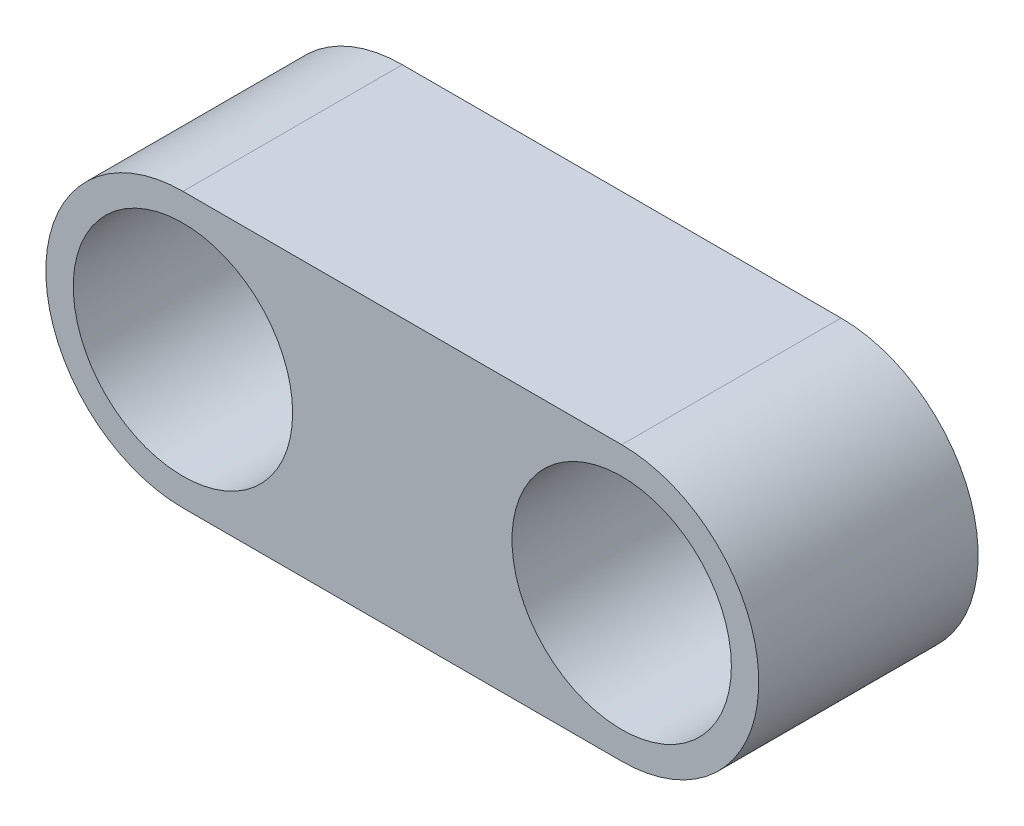
ISO-10303-21;
HEADER;
FILE_DESCRIPTION(('STEP AP214'),'2;1');
FILE_NAME('part.step','',(''),(''),'','','');
FILE_SCHEMA(('AUTOMOTIVE_DESIGN { 1 0 10303 214 1 1 1 1 }'));
ENDSEC;
DATA;
#1=APPLICATION_CONTEXT('core data for automotive mechanical design processes');
#2=APPLICATION_PROTOCOL_DEFINITION('international standard','automotive_design',2000,#1);
#3=PRODUCT_CONTEXT('',#1,'mechanical');
#4=PRODUCT('Part','Part','',(#3));
#5=PRODUCT_RELATED_PRODUCT_CATEGORY('part','',(#4));
#6=PRODUCT_DEFINITION_FORMATION('','',#4);
#7=PRODUCT_DEFINITION_CONTEXT('part definition',#1,'design');
#8=PRODUCT_DEFINITION('design','',#6,#7);
#9=PRODUCT_DEFINITION_SHAPE('','',#8);
#10=(LENGTH_UNIT() NAMED_UNIT(*) SI_UNIT(.MILLI.,.METRE.));
#11=(NAMED_UNIT(*) PLANE_ANGLE_UNIT() SI_UNIT($,.RADIAN.));
#12=(NAMED_UNIT(*) SI_UNIT($,.STERADIAN.) SOLID_ANGLE_UNIT());
#13=UNCERTAINTY_MEASURE_WITH_UNIT(LENGTH_MEASURE(1.E-05),#10,'distance_accuracy_value','');
#14=(GEOMETRIC_REPRESENTATION_CONTEXT(3) GLOBAL_UNCERTAINTY_ASSIGNED_CONTEXT((#13)) GLOBAL_UNIT_ASSIGNED_CONTEXT((#10,
#11,#12)) REPRESENTATION_CONTEXT('',''));
#15=CARTESIAN_POINT('',(0.,0.,0.));
#16=DIRECTION('',(0.,0.,1.));
#17=DIRECTION('',(1.,0.,0.));
#18=AXIS2_PLACEMENT_3D('',#15,#16,#17);
#19=CARTESIAN_POINT('',(-100.635802194931,0.,50.8));
#20=DIRECTION('',(0.,0.,1.));
#21=DIRECTION('',(1.,0.,0.));
#22=AXIS2_PLACEMENT_3D('',#19,#20,#21);
#23=PLANE('',#22);
#24=CARTESIAN_POINT('',(-100.635802194931,0.,50.8));
#25=DIRECTION('',(0.,0.,1.));
#26=DIRECTION('',(1.,0.,0.));
#27=AXIS2_PLACEMENT_3D('',#24,#25,#26);
#28=CIRCLE('',#27,25.4);
#29=CARTESIAN_POINT('',(-75.2358021949307,0.,50.8));
#30=VERTEX_POINT('',#29);
#31=EDGE_CURVE('E106',#30,#30,#28,.T.);
#32=ORIENTED_EDGE('',*,*,#31,.F.);
#33=EDGE_LOOP('',(#32));
#34=FACE_BOUND('',#33,.T.);
#35=CARTESIAN_POINT('',(-100.635802194931,0.,50.8));
#36=DIRECTION('',(0.,0.,1.));
#37=DIRECTION('',(1.,0.,0.));
#38=AXIS2_PLACEMENT_3D('',#35,#36,#37);
#39=CIRCLE('',#38,31.75);
#40=CARTESIAN_POINT('',(-100.635802194931,31.75,50.8));
#41=VERTEX_POINT('',#40);
#42=CARTESIAN_POINT('',(-100.635802194931,-31.75,50.8));
#43=VERTEX_POINT('',#42);
#44=EDGE_CURVE('E91',#41,#43,#39,.T.);
#45=ORIENTED_EDGE('',*,*,#44,.T.);
#46=DIRECTION('',(1.,0.,0.));
#47=VECTOR('',#46,1.);
#48=CARTESIAN_POINT('',(-100.635802194931,-31.75,50.8));
#49=LINE('',#48,#47);
#50=CARTESIAN_POINT('',(0.964197805069255,-31.75,50.8));
#51=VERTEX_POINT('',#50);
#52=EDGE_CURVE('E86',#43,#51,#49,.T.);
#53=ORIENTED_EDGE('',*,*,#52,.T.);
#54=CARTESIAN_POINT('',(0.964197805069261,0.,50.8));
#55=DIRECTION('',(0.,0.,1.));
#56=DIRECTION('',(1.,0.,0.));
#57=AXIS2_PLACEMENT_3D('',#54,#55,#56);
#58=CIRCLE('',#57,31.75);
#59=CARTESIAN_POINT('',(0.964197805069261,31.75,50.8));
#60=VERTEX_POINT('',#59);
#61=EDGE_CURVE('E89',#51,#60,#58,.T.);
#62=ORIENTED_EDGE('',*,*,#61,.T.);
#63=DIRECTION('',(-1.,0.,0.));
#64=VECTOR('',#63,1.);
#65=CARTESIAN_POINT('',(-100.635802194931,31.75,50.8));
#66=LINE('',#65,#64);
#67=EDGE_CURVE('E56',#60,#41,#66,.T.);
#68=ORIENTED_EDGE('',*,*,#67,.T.);
#69=EDGE_LOOP('',(#45,#53,#62,#68));
#70=FACE_BOUND('',#69,.T.);
#71=CARTESIAN_POINT('',(0.964197805069261,0.,50.8));
#72=DIRECTION('',(0.,0.,1.));
#73=DIRECTION('',(1.,0.,0.));
#74=AXIS2_PLACEMENT_3D('',#71,#72,#73);
#75=CIRCLE('',#74,25.4);
#76=CARTESIAN_POINT('',(26.3641978050693,0.,50.8));
#77=VERTEX_POINT('',#76);
#78=EDGE_CURVE('E121',#77,#77,#75,.T.);
#79=ORIENTED_EDGE('',*,*,#78,.F.);
#80=EDGE_LOOP('',(#79));
#81=FACE_BOUND('',#80,.T.);
#82=ADVANCED_FACE('F39',(#34,#70,#81),#23,.T.);
#83=CARTESIAN_POINT('',(-100.635802194931,0.,0.));
#84=DIRECTION('',(0.,0.,1.));
#85=DIRECTION('',(1.,0.,0.));
#86=AXIS2_PLACEMENT_3D('',#83,#84,#85);
#87=PLANE('',#86);
#88=CARTESIAN_POINT('',(-100.635802194931,0.,0.));
#89=DIRECTION('',(0.,0.,1.));
#90=DIRECTION('',(1.,0.,0.));
#91=AXIS2_PLACEMENT_3D('',#88,#89,#90);
#92=CIRCLE('',#91,25.4);
#93=CARTESIAN_POINT('',(-75.2358021949307,0.,0.));
#94=VERTEX_POINT('',#93);
#95=EDGE_CURVE('E118',#94,#94,#92,.T.);
#96=ORIENTED_EDGE('',*,*,#95,.T.);
#97=EDGE_LOOP('',(#96));
#98=FACE_BOUND('',#97,.T.);
#99=CARTESIAN_POINT('',(-100.635802194931,0.,0.));
#100=DIRECTION('',(0.,0.,1.));
#101=DIRECTION('',(1.,0.,0.));
#102=AXIS2_PLACEMENT_3D('',#99,#100,#101);
#103=CIRCLE('',#102,31.75);
#104=CARTESIAN_POINT('',(-100.635802194931,31.75,0.));
#105=VERTEX_POINT('',#104);
#106=CARTESIAN_POINT('',(-100.635802194931,-31.75,0.));
#107=VERTEX_POINT('',#106);
#108=EDGE_CURVE('E103',#105,#107,#103,.T.);
#109=ORIENTED_EDGE('',*,*,#108,.F.);
#110=DIRECTION('',(-1.,0.,0.));
#111=VECTOR('',#110,1.);
#112=CARTESIAN_POINT('',(-100.635802194931,31.75,0.));
#113=LINE('',#112,#111);
#114=CARTESIAN_POINT('',(0.964197805069261,31.75,0.));
#115=VERTEX_POINT('',#114);
#116=EDGE_CURVE('E79',#115,#105,#113,.T.);
#117=ORIENTED_EDGE('',*,*,#116,.F.);
#118=CARTESIAN_POINT('',(0.964197805069261,0.,0.));
#119=DIRECTION('',(0.,0.,1.));
#120=DIRECTION('',(1.,0.,0.));
#121=AXIS2_PLACEMENT_3D('',#118,#119,#120);
#122=CIRCLE('',#121,31.75);
#123=CARTESIAN_POINT('',(0.964197805069255,-31.75,0.));
#124=VERTEX_POINT('',#123);
#125=EDGE_CURVE('E73',#124,#115,#122,.T.);
#126=ORIENTED_EDGE('',*,*,#125,.F.);
#127=DIRECTION('',(1.,0.,0.));
#128=VECTOR('',#127,1.);
#129=CARTESIAN_POINT('',(-100.635802194931,-31.75,0.));
#130=LINE('',#129,#128);
#131=EDGE_CURVE('E95',#107,#124,#130,.T.);
#132=ORIENTED_EDGE('',*,*,#131,.F.);
#133=EDGE_LOOP('',(#109,#117,#126,#132));
#134=FACE_BOUND('',#133,.T.);
#135=CARTESIAN_POINT('',(0.964197805069261,0.,0.));
#136=DIRECTION('',(0.,0.,1.));
#137=DIRECTION('',(1.,0.,0.));
#138=AXIS2_PLACEMENT_3D('',#135,#136,#137);
#139=CIRCLE('',#138,25.4);
#140=CARTESIAN_POINT('',(26.3641978050693,0.,0.));
#141=VERTEX_POINT('',#140);
#142=EDGE_CURVE('E124',#141,#141,#139,.T.);
#143=ORIENTED_EDGE('',*,*,#142,.T.);
#144=EDGE_LOOP('',(#143));
#145=FACE_BOUND('',#144,.T.);
#146=ADVANCED_FACE('F114',(#98,#134,#145),#87,.F.);
#147=CARTESIAN_POINT('',(-100.635802194931,0.,50.8));
#148=DIRECTION('',(0.,0.,-1.));
#149=DIRECTION('',(-1.,0.,0.));
#150=AXIS2_PLACEMENT_3D('',#147,#148,#149);
#151=CYLINDRICAL_SURFACE('',#150,31.75);
#152=ORIENTED_EDGE('',*,*,#108,.T.);
#153=DIRECTION('',(0.,0.,-1.));
#154=VECTOR('',#153,1.);
#155=CARTESIAN_POINT('',(-100.635802194931,-31.75,50.8));
#156=LINE('',#155,#154);
#157=EDGE_CURVE('E11',#43,#107,#156,.T.);
#158=ORIENTED_EDGE('',*,*,#157,.F.);
#159=ORIENTED_EDGE('',*,*,#44,.F.);
#160=DIRECTION('',(0.,0.,-1.));
#161=VECTOR('',#160,1.);
#162=CARTESIAN_POINT('',(-100.635802194931,31.75,50.8));
#163=LINE('',#162,#161);
#164=EDGE_CURVE('E99',#41,#105,#163,.T.);
#165=ORIENTED_EDGE('',*,*,#164,.T.);
#166=EDGE_LOOP('',(#152,#158,#159,#165));
#167=FACE_BOUND('',#166,.T.);
#168=ADVANCED_FACE('F41',(#167),#151,.T.);
#169=CARTESIAN_POINT('',(-100.635802194931,-31.75,50.8));
#170=DIRECTION('',(0.,1.,0.));
#171=DIRECTION('',(-1.,0.,0.));
#172=AXIS2_PLACEMENT_3D('',#169,#170,#171);
#173=PLANE('',#172);
#174=ORIENTED_EDGE('',*,*,#131,.T.);
#175=DIRECTION('',(0.,0.,-1.));
#176=VECTOR('',#175,1.);
#177=CARTESIAN_POINT('',(0.964197805069255,-31.75,50.8));
#178=LINE('',#177,#176);
#179=EDGE_CURVE('E48',#51,#124,#178,.T.);
#180=ORIENTED_EDGE('',*,*,#179,.F.);
#181=ORIENTED_EDGE('',*,*,#52,.F.);
#182=ORIENTED_EDGE('',*,*,#157,.T.);
#183=EDGE_LOOP('',(#174,#180,#181,#182));
#184=FACE_BOUND('',#183,.T.);
#185=ADVANCED_FACE('F94',(#184),#173,.F.);
#186=CARTESIAN_POINT('',(0.964197805069261,0.,50.8));
#187=DIRECTION('',(0.,0.,-1.));
#188=DIRECTION('',(-1.,0.,0.));
#189=AXIS2_PLACEMENT_3D('',#186,#187,#188);
#190=CYLINDRICAL_SURFACE('',#189,31.75);
#191=ORIENTED_EDGE('',*,*,#125,.T.);
#192=DIRECTION('',(0.,0.,-1.));
#193=VECTOR('',#192,1.);
#194=CARTESIAN_POINT('',(0.964197805069261,31.75,50.8));
#195=LINE('',#194,#193);
#196=EDGE_CURVE('E96',#60,#115,#195,.T.);
#197=ORIENTED_EDGE('',*,*,#196,.F.);
#198=ORIENTED_EDGE('',*,*,#61,.F.);
#199=ORIENTED_EDGE('',*,*,#179,.T.);
#200=EDGE_LOOP('',(#191,#197,#198,#199));
#201=FACE_BOUND('',#200,.T.);
#202=ADVANCED_FACE('F97',(#201),#190,.T.);
#203=CARTESIAN_POINT('',(-100.635802194931,31.75,50.8));
#204=DIRECTION('',(0.,-1.,0.));
#205=DIRECTION('',(1.,0.,0.));
#206=AXIS2_PLACEMENT_3D('',#203,#204,#205);
#207=PLANE('',#206);
#208=ORIENTED_EDGE('',*,*,#116,.T.);
#209=ORIENTED_EDGE('',*,*,#164,.F.);
#210=ORIENTED_EDGE('',*,*,#67,.F.);
#211=ORIENTED_EDGE('',*,*,#196,.T.);
#212=EDGE_LOOP('',(#208,#209,#210,#211));
#213=FACE_BOUND('',#212,.T.);
#214=ADVANCED_FACE('F111',(#213),#207,.F.);
#215=CARTESIAN_POINT('',(-100.635802194931,0.,50.8));
#216=DIRECTION('',(0.,0.,-1.));
#217=DIRECTION('',(-1.,0.,0.));
#218=AXIS2_PLACEMENT_3D('',#215,#216,#217);
#219=CYLINDRICAL_SURFACE('',#218,25.4);
#220=ORIENTED_EDGE('',*,*,#31,.T.);
#221=EDGE_LOOP('',(#220));
#222=FACE_BOUND('',#221,.T.);
#223=ORIENTED_EDGE('',*,*,#95,.F.);
#224=EDGE_LOOP('',(#223));
#225=FACE_BOUND('',#224,.T.);
#226=ADVANCED_FACE('F142',(#222,#225),#219,.F.);
#227=CARTESIAN_POINT('',(0.964197805069261,0.,50.8));
#228=DIRECTION('',(0.,0.,-1.));
#229=DIRECTION('',(-1.,0.,0.));
#230=AXIS2_PLACEMENT_3D('',#227,#228,#229);
#231=CYLINDRICAL_SURFACE('',#230,25.4);
#232=ORIENTED_EDGE('',*,*,#78,.T.);
#233=EDGE_LOOP('',(#232));
#234=FACE_BOUND('',#233,.T.);
#235=ORIENTED_EDGE('',*,*,#142,.F.);
#236=EDGE_LOOP('',(#235));
#237=FACE_BOUND('',#236,.T.);
#238=ADVANCED_FACE('F130',(#234,#237),#231,.F.);
#239=CLOSED_SHELL('',(#82,#146,#168,#185,#202,#214,#226,#238));
#240=MANIFOLD_SOLID_BREP('B2',#239);
#241=ADVANCED_BREP_SHAPE_REPRESENTATION('',(#18,#240),#14);
#242=SHAPE_DEFINITION_REPRESENTATION(#9,#241);
ENDSEC;
END-ISO-10303-21;
